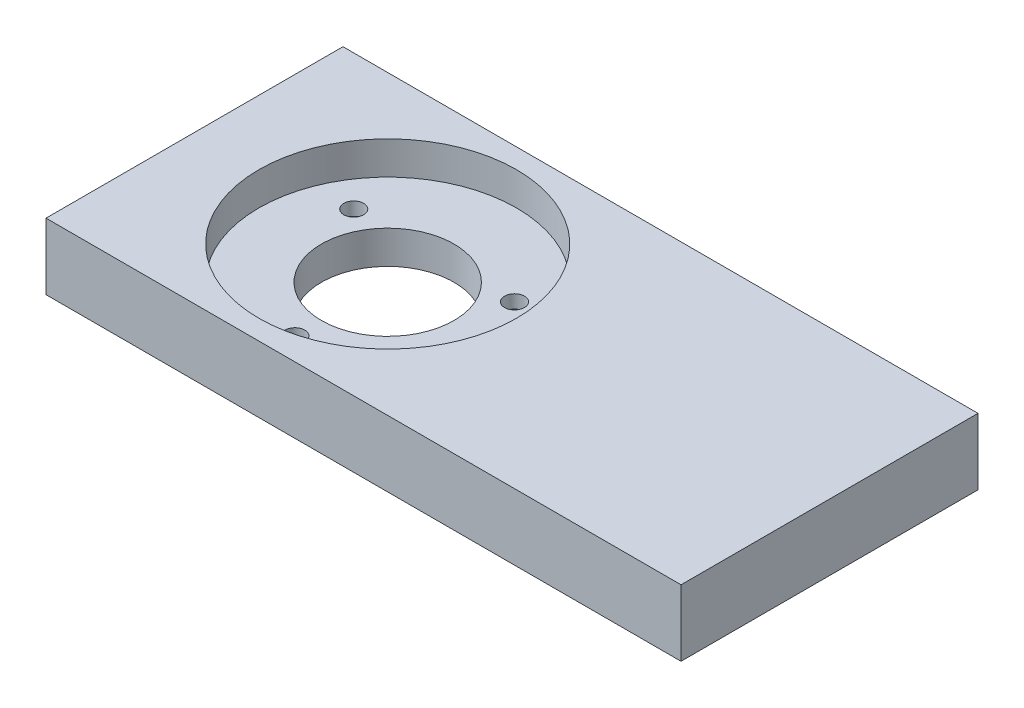
ISO-10303-21;
HEADER;
FILE_DESCRIPTION(('STEP AP214'),'2;1');
FILE_NAME('part.step','',(''),(''),'','','');
FILE_SCHEMA(('AUTOMOTIVE_DESIGN { 1 0 10303 214 1 1 1 1 }'));
ENDSEC;
DATA;
#1=APPLICATION_CONTEXT('core data for automotive mechanical design processes');
#2=APPLICATION_PROTOCOL_DEFINITION('international standard','automotive_design',2000,#1);
#3=PRODUCT_CONTEXT('',#1,'mechanical');
#4=PRODUCT('Part','Part','',(#3));
#5=PRODUCT_RELATED_PRODUCT_CATEGORY('part','',(#4));
#6=PRODUCT_DEFINITION_FORMATION('','',#4);
#7=PRODUCT_DEFINITION_CONTEXT('part definition',#1,'design');
#8=PRODUCT_DEFINITION('design','',#6,#7);
#9=PRODUCT_DEFINITION_SHAPE('','',#8);
#10=(LENGTH_UNIT() NAMED_UNIT(*) SI_UNIT(.MILLI.,.METRE.));
#11=(NAMED_UNIT(*) PLANE_ANGLE_UNIT() SI_UNIT($,.RADIAN.));
#12=(NAMED_UNIT(*) SI_UNIT($,.STERADIAN.) SOLID_ANGLE_UNIT());
#13=UNCERTAINTY_MEASURE_WITH_UNIT(LENGTH_MEASURE(1.E-05),#10,'distance_accuracy_value','');
#14=(GEOMETRIC_REPRESENTATION_CONTEXT(3) GLOBAL_UNCERTAINTY_ASSIGNED_CONTEXT((#13)) GLOBAL_UNIT_ASSIGNED_CONTEXT((#10,
#11,#12)) REPRESENTATION_CONTEXT('',''));
#15=CARTESIAN_POINT('',(0.,0.,0.));
#16=DIRECTION('',(0.,0.,1.));
#17=DIRECTION('',(1.,0.,0.));
#18=AXIS2_PLACEMENT_3D('',#15,#16,#17);
#19=CARTESIAN_POINT('',(-22.2018497324521,0.,-7.35930969516135));
#20=DIRECTION('',(0.,1.,0.));
#21=DIRECTION('',(0.,0.,1.));
#22=AXIS2_PLACEMENT_3D('',#19,#20,#21);
#23=CYLINDRICAL_SURFACE('',#22,1.5);
#24=CARTESIAN_POINT('',(-22.2018497324521,5.,-7.35930969516135));
#25=DIRECTION('',(0.,1.,0.));
#26=DIRECTION('',(0.,0.,1.));
#27=AXIS2_PLACEMENT_3D('',#24,#25,#26);
#28=CIRCLE('',#27,1.5);
#29=CARTESIAN_POINT('',(-22.2018497324521,5.,-5.85930969516135));
#30=VERTEX_POINT('',#29);
#31=EDGE_CURVE('E130',#30,#30,#28,.T.);
#32=ORIENTED_EDGE('',*,*,#31,.T.);
#33=EDGE_LOOP('',(#32));
#34=FACE_BOUND('',#33,.T.);
#35=CARTESIAN_POINT('',(-22.2018497324521,3.,-7.35930969516135));
#36=DIRECTION('',(0.,-1.,0.));
#37=DIRECTION('',(0.,0.,-1.));
#38=AXIS2_PLACEMENT_3D('',#35,#36,#37);
#39=CIRCLE('',#38,1.5);
#40=CARTESIAN_POINT('',(-22.2018497324521,3.,-8.85930969516135));
#41=VERTEX_POINT('',#40);
#42=EDGE_CURVE('E43',#41,#41,#39,.F.);
#43=ORIENTED_EDGE('',*,*,#42,.F.);
#44=EDGE_LOOP('',(#43));
#45=FACE_BOUND('',#44,.T.);
#46=ADVANCED_FACE('F39',(#34,#45),#23,.F.);
#47=CARTESIAN_POINT('',(-10.0768497324521,0.,13.6418063466113));
#48=DIRECTION('',(0.,1.,0.));
#49=DIRECTION('',(0.,0.,1.));
#50=AXIS2_PLACEMENT_3D('',#47,#48,#49);
#51=CYLINDRICAL_SURFACE('',#50,1.5);
#52=CARTESIAN_POINT('',(-10.0768497324521,5.,13.6418063466113));
#53=DIRECTION('',(0.,1.,0.));
#54=DIRECTION('',(0.,0.,1.));
#55=AXIS2_PLACEMENT_3D('',#52,#53,#54);
#56=CIRCLE('',#55,1.5);
#57=CARTESIAN_POINT('',(-10.0768497324521,5.,15.1418063466113));
#58=VERTEX_POINT('',#57);
#59=EDGE_CURVE('E132',#58,#58,#56,.T.);
#60=ORIENTED_EDGE('',*,*,#59,.T.);
#61=EDGE_LOOP('',(#60));
#62=FACE_BOUND('',#61,.T.);
#63=CARTESIAN_POINT('',(-10.0768497324521,3.,13.6418063466113));
#64=DIRECTION('',(0.,-1.,0.));
#65=DIRECTION('',(0.,0.,-1.));
#66=AXIS2_PLACEMENT_3D('',#63,#64,#65);
#67=CIRCLE('',#66,1.5);
#68=CARTESIAN_POINT('',(-10.0768497324521,3.,12.1418063466113));
#69=VERTEX_POINT('',#68);
#70=EDGE_CURVE('E122',#69,#69,#67,.F.);
#71=ORIENTED_EDGE('',*,*,#70,.F.);
#72=EDGE_LOOP('',(#71));
#73=FACE_BOUND('',#72,.T.);
#74=ADVANCED_FACE('F176',(#62,#73),#51,.F.);
#75=CARTESIAN_POINT('',(2.04815026754789,0.,-7.35930969516134));
#76=DIRECTION('',(0.,1.,0.));
#77=DIRECTION('',(0.,0.,1.));
#78=AXIS2_PLACEMENT_3D('',#75,#76,#77);
#79=CYLINDRICAL_SURFACE('',#78,1.5);
#80=CARTESIAN_POINT('',(2.04815026754789,5.,-7.35930969516134));
#81=DIRECTION('',(0.,1.,0.));
#82=DIRECTION('',(0.,0.,1.));
#83=AXIS2_PLACEMENT_3D('',#80,#81,#82);
#84=CIRCLE('',#83,1.5);
#85=CARTESIAN_POINT('',(2.04815026754789,5.,-5.85930969516134));
#86=VERTEX_POINT('',#85);
#87=EDGE_CURVE('E137',#86,#86,#84,.T.);
#88=ORIENTED_EDGE('',*,*,#87,.T.);
#89=EDGE_LOOP('',(#88));
#90=FACE_BOUND('',#89,.T.);
#91=CARTESIAN_POINT('',(2.04815026754789,3.,-7.35930969516134));
#92=DIRECTION('',(0.,-1.,0.));
#93=DIRECTION('',(0.,0.,-1.));
#94=AXIS2_PLACEMENT_3D('',#91,#92,#93);
#95=CIRCLE('',#94,1.5);
#96=CARTESIAN_POINT('',(2.04815026754789,3.,-8.85930969516135));
#97=VERTEX_POINT('',#96);
#98=EDGE_CURVE('E118',#97,#97,#95,.F.);
#99=ORIENTED_EDGE('',*,*,#98,.F.);
#100=EDGE_LOOP('',(#99));
#101=FACE_BOUND('',#100,.T.);
#102=ADVANCED_FACE('F151',(#90,#101),#79,.F.);
#103=CARTESIAN_POINT('',(-10.0768497324521,0.,-0.358937681237133));
#104=DIRECTION('',(0.,1.,0.));
#105=DIRECTION('',(0.,0.,1.));
#106=AXIS2_PLACEMENT_3D('',#103,#104,#105);
#107=CYLINDRICAL_SURFACE('',#106,10.);
#108=CARTESIAN_POINT('',(-10.0768497324521,0.,-0.358937681237133));
#109=DIRECTION('',(0.,1.,0.));
#110=DIRECTION('',(0.,0.,1.));
#111=AXIS2_PLACEMENT_3D('',#108,#109,#110);
#112=CIRCLE('',#111,10.);
#113=CARTESIAN_POINT('',(-10.0768497324521,0.,9.64106231876287));
#114=VERTEX_POINT('',#113);
#115=EDGE_CURVE('E107',#114,#114,#112,.T.);
#116=ORIENTED_EDGE('',*,*,#115,.F.);
#117=EDGE_LOOP('',(#116));
#118=FACE_BOUND('',#117,.T.);
#119=CARTESIAN_POINT('',(-10.0768497324521,5.,-0.358937681237133));
#120=DIRECTION('',(0.,1.,0.));
#121=DIRECTION('',(0.,0.,1.));
#122=AXIS2_PLACEMENT_3D('',#119,#120,#121);
#123=CIRCLE('',#122,10.);
#124=CARTESIAN_POINT('',(-10.0768497324521,5.,9.64106231876287));
#125=VERTEX_POINT('',#124);
#126=EDGE_CURVE('E114',#125,#125,#123,.F.);
#127=ORIENTED_EDGE('',*,*,#126,.F.);
#128=EDGE_LOOP('',(#127));
#129=FACE_BOUND('',#128,.T.);
#130=ADVANCED_FACE('F152',(#118,#129),#107,.F.);
#131=CARTESIAN_POINT('',(-39.2268497324521,10.,-22.7589376812371));
#132=DIRECTION('',(1.,0.,0.));
#133=DIRECTION('',(0.,0.,-1.));
#134=AXIS2_PLACEMENT_3D('',#131,#132,#133);
#135=PLANE('',#134);
#136=DIRECTION('',(0.,0.,1.));
#137=VECTOR('',#136,1.);
#138=CARTESIAN_POINT('',(-39.2268497324521,0.,-22.7589376812371));
#139=LINE('',#138,#137);
#140=CARTESIAN_POINT('',(-39.2268497324521,0.,-22.7589376812371));
#141=VERTEX_POINT('',#140);
#142=CARTESIAN_POINT('',(-39.2268497324521,0.,22.0410623187629));
#143=VERTEX_POINT('',#142);
#144=EDGE_CURVE('E106',#141,#143,#139,.T.);
#145=ORIENTED_EDGE('',*,*,#144,.T.);
#146=DIRECTION('',(0.,-1.,0.));
#147=VECTOR('',#146,1.);
#148=CARTESIAN_POINT('',(-39.2268497324521,10.,22.0410623187629));
#149=LINE('',#148,#147);
#150=CARTESIAN_POINT('',(-39.2268497324521,10.,22.0410623187629));
#151=VERTEX_POINT('',#150);
#152=EDGE_CURVE('E11',#151,#143,#149,.T.);
#153=ORIENTED_EDGE('',*,*,#152,.F.);
#154=DIRECTION('',(0.,0.,1.));
#155=VECTOR('',#154,1.);
#156=CARTESIAN_POINT('',(-39.2268497324521,10.,-22.7589376812371));
#157=LINE('',#156,#155);
#158=CARTESIAN_POINT('',(-39.2268497324521,10.,-22.7589376812371));
#159=VERTEX_POINT('',#158);
#160=EDGE_CURVE('E93',#159,#151,#157,.T.);
#161=ORIENTED_EDGE('',*,*,#160,.F.);
#162=DIRECTION('',(0.,-1.,0.));
#163=VECTOR('',#162,1.);
#164=CARTESIAN_POINT('',(-39.2268497324521,10.,-22.7589376812371));
#165=LINE('',#164,#163);
#166=EDGE_CURVE('E105',#159,#141,#165,.T.);
#167=ORIENTED_EDGE('',*,*,#166,.T.);
#168=EDGE_LOOP('',(#145,#153,#161,#167));
#169=FACE_BOUND('',#168,.T.);
#170=ADVANCED_FACE('F41',(#169),#135,.F.);
#171=CARTESIAN_POINT('',(-39.2268497324521,10.,22.0410623187629));
#172=DIRECTION('',(0.,0.,-1.));
#173=DIRECTION('',(-1.,0.,0.));
#174=AXIS2_PLACEMENT_3D('',#171,#172,#173);
#175=PLANE('',#174);
#176=DIRECTION('',(1.,0.,0.));
#177=VECTOR('',#176,1.);
#178=CARTESIAN_POINT('',(-39.2268497324521,0.,22.0410623187629));
#179=LINE('',#178,#177);
#180=CARTESIAN_POINT('',(56.5731502675479,0.,22.0410623187629));
#181=VERTEX_POINT('',#180);
#182=EDGE_CURVE('E97',#143,#181,#179,.T.);
#183=ORIENTED_EDGE('',*,*,#182,.T.);
#184=DIRECTION('',(0.,-1.,0.));
#185=VECTOR('',#184,1.);
#186=CARTESIAN_POINT('',(56.5731502675479,10.,22.0410623187629));
#187=LINE('',#186,#185);
#188=CARTESIAN_POINT('',(56.5731502675479,10.,22.0410623187629));
#189=VERTEX_POINT('',#188);
#190=EDGE_CURVE('E47',#189,#181,#187,.T.);
#191=ORIENTED_EDGE('',*,*,#190,.F.);
#192=DIRECTION('',(1.,0.,0.));
#193=VECTOR('',#192,1.);
#194=CARTESIAN_POINT('',(-39.2268497324521,10.,22.0410623187629));
#195=LINE('',#194,#193);
#196=EDGE_CURVE('E89',#151,#189,#195,.T.);
#197=ORIENTED_EDGE('',*,*,#196,.F.);
#198=ORIENTED_EDGE('',*,*,#152,.T.);
#199=EDGE_LOOP('',(#183,#191,#197,#198));
#200=FACE_BOUND('',#199,.T.);
#201=ADVANCED_FACE('F98',(#200),#175,.F.);
#202=CARTESIAN_POINT('',(56.5731502675479,10.,-22.7589376812371));
#203=DIRECTION('',(-1.,0.,0.));
#204=DIRECTION('',(0.,0.,1.));
#205=AXIS2_PLACEMENT_3D('',#202,#203,#204);
#206=PLANE('',#205);
#207=DIRECTION('',(0.,0.,-1.));
#208=VECTOR('',#207,1.);
#209=CARTESIAN_POINT('',(56.5731502675479,0.,-22.7589376812371));
#210=LINE('',#209,#208);
#211=CARTESIAN_POINT('',(56.5731502675479,0.,-22.7589376812371));
#212=VERTEX_POINT('',#211);
#213=EDGE_CURVE('E71',#181,#212,#210,.T.);
#214=ORIENTED_EDGE('',*,*,#213,.T.);
#215=DIRECTION('',(0.,-1.,0.));
#216=VECTOR('',#215,1.);
#217=CARTESIAN_POINT('',(56.5731502675479,10.,-22.7589376812371));
#218=LINE('',#217,#216);
#219=CARTESIAN_POINT('',(56.5731502675479,10.,-22.7589376812371));
#220=VERTEX_POINT('',#219);
#221=EDGE_CURVE('E96',#220,#212,#218,.T.);
#222=ORIENTED_EDGE('',*,*,#221,.F.);
#223=DIRECTION('',(0.,0.,-1.));
#224=VECTOR('',#223,1.);
#225=CARTESIAN_POINT('',(56.5731502675479,10.,-22.7589376812371));
#226=LINE('',#225,#224);
#227=EDGE_CURVE('E92',#189,#220,#226,.T.);
#228=ORIENTED_EDGE('',*,*,#227,.F.);
#229=ORIENTED_EDGE('',*,*,#190,.T.);
#230=EDGE_LOOP('',(#214,#222,#228,#229));
#231=FACE_BOUND('',#230,.T.);
#232=ADVANCED_FACE('F99',(#231),#206,.F.);
#233=CARTESIAN_POINT('',(-39.2268497324521,10.,-22.7589376812371));
#234=DIRECTION('',(0.,0.,1.));
#235=DIRECTION('',(1.,0.,0.));
#236=AXIS2_PLACEMENT_3D('',#233,#234,#235);
#237=PLANE('',#236);
#238=DIRECTION('',(-1.,0.,0.));
#239=VECTOR('',#238,1.);
#240=CARTESIAN_POINT('',(-39.2268497324521,0.,-22.7589376812371));
#241=LINE('',#240,#239);
#242=EDGE_CURVE('E82',#212,#141,#241,.T.);
#243=ORIENTED_EDGE('',*,*,#242,.T.);
#244=ORIENTED_EDGE('',*,*,#166,.F.);
#245=DIRECTION('',(-1.,0.,0.));
#246=VECTOR('',#245,1.);
#247=CARTESIAN_POINT('',(-39.2268497324521,10.,-22.7589376812371));
#248=LINE('',#247,#246);
#249=EDGE_CURVE('E59',#220,#159,#248,.T.);
#250=ORIENTED_EDGE('',*,*,#249,.F.);
#251=ORIENTED_EDGE('',*,*,#221,.T.);
#252=EDGE_LOOP('',(#243,#244,#250,#251));
#253=FACE_BOUND('',#252,.T.);
#254=ADVANCED_FACE('F319',(#253),#237,.F.);
#255=CARTESIAN_POINT('',(0.,10.,0.));
#256=DIRECTION('',(0.,1.,0.));
#257=DIRECTION('',(0.,0.,1.));
#258=AXIS2_PLACEMENT_3D('',#255,#256,#257);
#259=PLANE('',#258);
#260=CARTESIAN_POINT('',(-10.0768497324521,10.,-0.358937681237133));
#261=DIRECTION('',(0.,1.,0.));
#262=DIRECTION('',(0.,0.,1.));
#263=AXIS2_PLACEMENT_3D('',#260,#261,#262);
#264=CIRCLE('',#263,19.425);
#265=CARTESIAN_POINT('',(-10.0768497324521,10.,19.0660623187629));
#266=VERTEX_POINT('',#265);
#267=EDGE_CURVE('E145',#266,#266,#264,.T.);
#268=ORIENTED_EDGE('',*,*,#267,.F.);
#269=EDGE_LOOP('',(#268));
#270=FACE_BOUND('',#269,.T.);
#271=ORIENTED_EDGE('',*,*,#160,.T.);
#272=ORIENTED_EDGE('',*,*,#196,.T.);
#273=ORIENTED_EDGE('',*,*,#227,.T.);
#274=ORIENTED_EDGE('',*,*,#249,.T.);
#275=EDGE_LOOP('',(#271,#272,#273,#274));
#276=FACE_BOUND('',#275,.T.);
#277=ADVANCED_FACE('F86',(#270,#276),#259,.T.);
#278=CARTESIAN_POINT('',(0.,0.,0.));
#279=DIRECTION('',(0.,1.,0.));
#280=DIRECTION('',(0.,0.,1.));
#281=AXIS2_PLACEMENT_3D('',#278,#279,#280);
#282=PLANE('',#281);
#283=CARTESIAN_POINT('',(-10.0768497324521,0.,13.6418063466113));
#284=DIRECTION('',(0.,-1.,0.));
#285=DIRECTION('',(0.,0.,-1.));
#286=AXIS2_PLACEMENT_3D('',#283,#284,#285);
#287=CIRCLE('',#286,3.);
#288=CARTESIAN_POINT('',(-10.0768497324521,0.,10.6418063466113));
#289=VERTEX_POINT('',#288);
#290=EDGE_CURVE('E214',#289,#289,#287,.T.);
#291=ORIENTED_EDGE('',*,*,#290,.F.);
#292=EDGE_LOOP('',(#291));
#293=FACE_BOUND('',#292,.T.);
#294=CARTESIAN_POINT('',(-22.2018497324521,0.,-7.35930969516135));
#295=DIRECTION('',(0.,-1.,0.));
#296=DIRECTION('',(0.,0.,-1.));
#297=AXIS2_PLACEMENT_3D('',#294,#295,#296);
#298=CIRCLE('',#297,3.);
#299=CARTESIAN_POINT('',(-22.2018497324521,0.,-10.3593096951613));
#300=VERTEX_POINT('',#299);
#301=EDGE_CURVE('E217',#300,#300,#298,.T.);
#302=ORIENTED_EDGE('',*,*,#301,.F.);
#303=EDGE_LOOP('',(#302));
#304=FACE_BOUND('',#303,.T.);
#305=CARTESIAN_POINT('',(2.04815026754789,0.,-7.35930969516134));
#306=DIRECTION('',(0.,-1.,0.));
#307=DIRECTION('',(0.,0.,-1.));
#308=AXIS2_PLACEMENT_3D('',#305,#306,#307);
#309=CIRCLE('',#308,3.);
#310=CARTESIAN_POINT('',(2.04815026754789,0.,-10.3593096951613));
#311=VERTEX_POINT('',#310);
#312=EDGE_CURVE('E224',#311,#311,#309,.T.);
#313=ORIENTED_EDGE('',*,*,#312,.F.);
#314=EDGE_LOOP('',(#313));
#315=FACE_BOUND('',#314,.T.);
#316=ORIENTED_EDGE('',*,*,#115,.T.);
#317=EDGE_LOOP('',(#316));
#318=FACE_BOUND('',#317,.T.);
#319=ORIENTED_EDGE('',*,*,#144,.F.);
#320=ORIENTED_EDGE('',*,*,#242,.F.);
#321=ORIENTED_EDGE('',*,*,#213,.F.);
#322=ORIENTED_EDGE('',*,*,#182,.F.);
#323=EDGE_LOOP('',(#319,#320,#321,#322));
#324=FACE_BOUND('',#323,.T.);
#325=ADVANCED_FACE('F149',(#293,#304,#315,#318,#324),#282,.F.);
#326=CARTESIAN_POINT('',(-10.0768497324521,5.,-0.358937681237133));
#327=DIRECTION('',(0.,1.,0.));
#328=DIRECTION('',(0.,0.,1.));
#329=AXIS2_PLACEMENT_3D('',#326,#327,#328);
#330=PLANE('',#329);
#331=ORIENTED_EDGE('',*,*,#87,.F.);
#332=EDGE_LOOP('',(#331));
#333=FACE_BOUND('',#332,.T.);
#334=ORIENTED_EDGE('',*,*,#59,.F.);
#335=EDGE_LOOP('',(#334));
#336=FACE_BOUND('',#335,.T.);
#337=ORIENTED_EDGE('',*,*,#31,.F.);
#338=EDGE_LOOP('',(#337));
#339=FACE_BOUND('',#338,.T.);
#340=CARTESIAN_POINT('',(-10.0768497324521,5.,-0.358937681237133));
#341=DIRECTION('',(0.,1.,0.));
#342=DIRECTION('',(0.,0.,1.));
#343=AXIS2_PLACEMENT_3D('',#340,#341,#342);
#344=CIRCLE('',#343,19.425);
#345=CARTESIAN_POINT('',(-10.0768497324521,5.,19.0660623187629));
#346=VERTEX_POINT('',#345);
#347=EDGE_CURVE('E117',#346,#346,#344,.T.);
#348=ORIENTED_EDGE('',*,*,#347,.T.);
#349=EDGE_LOOP('',(#348));
#350=FACE_BOUND('',#349,.T.);
#351=ORIENTED_EDGE('',*,*,#126,.T.);
#352=EDGE_LOOP('',(#351));
#353=FACE_BOUND('',#352,.T.);
#354=ADVANCED_FACE('F158',(#333,#336,#339,#350,#353),#330,.T.);
#355=CARTESIAN_POINT('',(-10.0768497324521,5.,-0.358937681237133));
#356=DIRECTION('',(0.,1.,0.));
#357=DIRECTION('',(0.,0.,1.));
#358=AXIS2_PLACEMENT_3D('',#355,#356,#357);
#359=CYLINDRICAL_SURFACE('',#358,19.425);
#360=ORIENTED_EDGE('',*,*,#347,.F.);
#361=EDGE_LOOP('',(#360));
#362=FACE_BOUND('',#361,.T.);
#363=ORIENTED_EDGE('',*,*,#267,.T.);
#364=EDGE_LOOP('',(#363));
#365=FACE_BOUND('',#364,.T.);
#366=ADVANCED_FACE('F156',(#362,#365),#359,.F.);
#367=CARTESIAN_POINT('',(2.04815026754789,3.,-7.35930969516134));
#368=DIRECTION('',(0.,-1.,0.));
#369=DIRECTION('',(0.,0.,-1.));
#370=AXIS2_PLACEMENT_3D('',#367,#368,#369);
#371=PLANE('',#370);
#372=CARTESIAN_POINT('',(2.04815026754789,3.,-7.35930969516134));
#373=DIRECTION('',(0.,-1.,0.));
#374=DIRECTION('',(0.,0.,-1.));
#375=AXIS2_PLACEMENT_3D('',#372,#373,#374);
#376=CIRCLE('',#375,3.);
#377=CARTESIAN_POINT('',(2.04815026754789,3.,-10.3593096951613));
#378=VERTEX_POINT('',#377);
#379=EDGE_CURVE('E227',#378,#378,#376,.T.);
#380=ORIENTED_EDGE('',*,*,#379,.T.);
#381=EDGE_LOOP('',(#380));
#382=FACE_BOUND('',#381,.T.);
#383=ORIENTED_EDGE('',*,*,#98,.T.);
#384=EDGE_LOOP('',(#383));
#385=FACE_BOUND('',#384,.T.);
#386=ADVANCED_FACE('F170',(#382,#385),#371,.T.);
#387=CARTESIAN_POINT('',(2.04815026754789,3.,-7.35930969516134));
#388=DIRECTION('',(0.,-1.,0.));
#389=DIRECTION('',(0.,0.,-1.));
#390=AXIS2_PLACEMENT_3D('',#387,#388,#389);
#391=CYLINDRICAL_SURFACE('',#390,3.);
#392=ORIENTED_EDGE('',*,*,#379,.F.);
#393=EDGE_LOOP('',(#392));
#394=FACE_BOUND('',#393,.T.);
#395=ORIENTED_EDGE('',*,*,#312,.T.);
#396=EDGE_LOOP('',(#395));
#397=FACE_BOUND('',#396,.T.);
#398=ADVANCED_FACE('F186',(#394,#397),#391,.F.);
#399=CARTESIAN_POINT('',(-10.0768497324521,3.,13.6418063466113));
#400=DIRECTION('',(0.,-1.,0.));
#401=DIRECTION('',(0.,0.,-1.));
#402=AXIS2_PLACEMENT_3D('',#399,#400,#401);
#403=PLANE('',#402);
#404=CARTESIAN_POINT('',(-10.0768497324521,3.,13.6418063466113));
#405=DIRECTION('',(0.,-1.,0.));
#406=DIRECTION('',(0.,0.,-1.));
#407=AXIS2_PLACEMENT_3D('',#404,#405,#406);
#408=CIRCLE('',#407,3.);
#409=CARTESIAN_POINT('',(-10.0768497324521,3.,10.6418063466113));
#410=VERTEX_POINT('',#409);
#411=EDGE_CURVE('E125',#410,#410,#408,.T.);
#412=ORIENTED_EDGE('',*,*,#411,.T.);
#413=EDGE_LOOP('',(#412));
#414=FACE_BOUND('',#413,.T.);
#415=ORIENTED_EDGE('',*,*,#70,.T.);
#416=EDGE_LOOP('',(#415));
#417=FACE_BOUND('',#416,.T.);
#418=ADVANCED_FACE('F194',(#414,#417),#403,.T.);
#419=CARTESIAN_POINT('',(-10.0768497324521,3.,13.6418063466113));
#420=DIRECTION('',(0.,-1.,0.));
#421=DIRECTION('',(0.,0.,-1.));
#422=AXIS2_PLACEMENT_3D('',#419,#420,#421);
#423=CYLINDRICAL_SURFACE('',#422,3.);
#424=ORIENTED_EDGE('',*,*,#411,.F.);
#425=EDGE_LOOP('',(#424));
#426=FACE_BOUND('',#425,.T.);
#427=ORIENTED_EDGE('',*,*,#290,.T.);
#428=EDGE_LOOP('',(#427));
#429=FACE_BOUND('',#428,.T.);
#430=ADVANCED_FACE('F196',(#426,#429),#423,.F.);
#431=CARTESIAN_POINT('',(-22.2018497324521,3.,-7.35930969516135));
#432=DIRECTION('',(0.,-1.,0.));
#433=DIRECTION('',(0.,0.,-1.));
#434=AXIS2_PLACEMENT_3D('',#431,#432,#433);
#435=PLANE('',#434);
#436=CARTESIAN_POINT('',(-22.2018497324521,3.,-7.35930969516135));
#437=DIRECTION('',(0.,-1.,0.));
#438=DIRECTION('',(0.,0.,-1.));
#439=AXIS2_PLACEMENT_3D('',#436,#437,#438);
#440=CIRCLE('',#439,3.);
#441=CARTESIAN_POINT('',(-22.2018497324521,3.,-10.3593096951613));
#442=VERTEX_POINT('',#441);
#443=EDGE_CURVE('E222',#442,#442,#440,.T.);
#444=ORIENTED_EDGE('',*,*,#443,.T.);
#445=EDGE_LOOP('',(#444));
#446=FACE_BOUND('',#445,.T.);
#447=ORIENTED_EDGE('',*,*,#42,.T.);
#448=EDGE_LOOP('',(#447));
#449=FACE_BOUND('',#448,.T.);
#450=ADVANCED_FACE('F193',(#446,#449),#435,.T.);
#451=CARTESIAN_POINT('',(-22.2018497324521,3.,-7.35930969516135));
#452=DIRECTION('',(0.,-1.,0.));
#453=DIRECTION('',(0.,0.,-1.));
#454=AXIS2_PLACEMENT_3D('',#451,#452,#453);
#455=CYLINDRICAL_SURFACE('',#454,3.);
#456=ORIENTED_EDGE('',*,*,#443,.F.);
#457=EDGE_LOOP('',(#456));
#458=FACE_BOUND('',#457,.T.);
#459=ORIENTED_EDGE('',*,*,#301,.T.);
#460=EDGE_LOOP('',(#459));
#461=FACE_BOUND('',#460,.T.);
#462=ADVANCED_FACE('F199',(#458,#461),#455,.F.);
#463=CLOSED_SHELL('',(#46,#74,#102,#130,#170,#201,#232,#254,#277,#325,#354,#366,#386,#398,#418,
#430,#450,#462));
#464=MANIFOLD_SOLID_BREP('B2',#463);
#465=ADVANCED_BREP_SHAPE_REPRESENTATION('',(#18,#464),#14);
#466=SHAPE_DEFINITION_REPRESENTATION(#9,#465);
ENDSEC;
END-ISO-10303-21;
